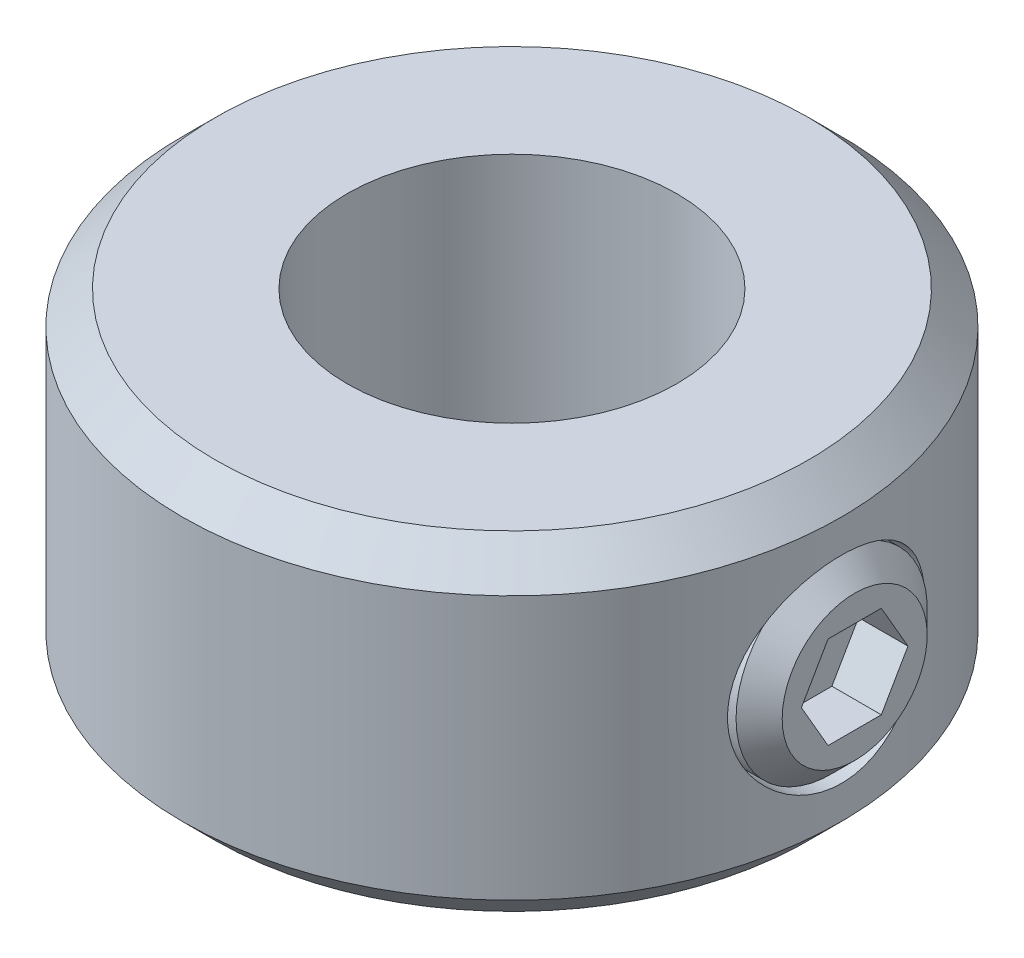
ISO-10303-21;
HEADER;
FILE_DESCRIPTION(('STEP AP214'),'2;1');
FILE_NAME('part.step','',(''),(''),'','','');
FILE_SCHEMA(('AUTOMOTIVE_DESIGN { 1 0 10303 214 1 1 1 1 }'));
ENDSEC;
DATA;
#1=APPLICATION_CONTEXT('core data for automotive mechanical design processes');
#2=APPLICATION_PROTOCOL_DEFINITION('international standard','automotive_design',2000,#1);
#3=PRODUCT_CONTEXT('',#1,'mechanical');
#4=PRODUCT('Part','Part','',(#3));
#5=PRODUCT_RELATED_PRODUCT_CATEGORY('part','',(#4));
#6=PRODUCT_DEFINITION_FORMATION('','',#4);
#7=PRODUCT_DEFINITION_CONTEXT('part definition',#1,'design');
#8=PRODUCT_DEFINITION('design','',#6,#7);
#9=PRODUCT_DEFINITION_SHAPE('','',#8);
#10=(LENGTH_UNIT() NAMED_UNIT(*) SI_UNIT(.MILLI.,.METRE.));
#11=(NAMED_UNIT(*) PLANE_ANGLE_UNIT() SI_UNIT($,.RADIAN.));
#12=(NAMED_UNIT(*) SI_UNIT($,.STERADIAN.) SOLID_ANGLE_UNIT());
#13=UNCERTAINTY_MEASURE_WITH_UNIT(LENGTH_MEASURE(1.E-05),#10,'distance_accuracy_value','');
#14=(GEOMETRIC_REPRESENTATION_CONTEXT(3) GLOBAL_UNCERTAINTY_ASSIGNED_CONTEXT((#13)) GLOBAL_UNIT_ASSIGNED_CONTEXT((#10,
#11,#12)) REPRESENTATION_CONTEXT('',''));
#15=CARTESIAN_POINT('',(0.,0.,0.));
#16=DIRECTION('',(0.,0.,1.));
#17=DIRECTION('',(1.,0.,0.));
#18=AXIS2_PLACEMENT_3D('',#15,#16,#17);
#19=CARTESIAN_POINT('',(5.2,2.5,0.));
#20=DIRECTION('',(-1.,0.,0.));
#21=DIRECTION('',(0.,0.,1.));
#22=AXIS2_PLACEMENT_3D('',#19,#20,#21);
#23=CYLINDRICAL_SURFACE('',#22,1.45);
#24=CARTESIAN_POINT('',(4.85,2.5,0.));
#25=DIRECTION('',(-1.,0.,0.));
#26=DIRECTION('',(0.,0.,1.));
#27=AXIS2_PLACEMENT_3D('',#24,#25,#26);
#28=CIRCLE('',#27,1.45);
#29=CARTESIAN_POINT('',(4.85,2.5,1.45));
#30=VERTEX_POINT('',#29);
#31=EDGE_CURVE('E70',#30,#30,#28,.T.);
#32=CARTESIAN_POINT('',(2.5,2.5,0.));
#33=DIRECTION('',(-1.,0.,0.));
#34=DIRECTION('',(0.,0.,1.));
#35=AXIS2_PLACEMENT_3D('',#32,#33,#34);
#36=CIRCLE('',#35,1.45);
#37=CARTESIAN_POINT('',(2.5,2.5,1.45));
#38=VERTEX_POINT('',#37);
#39=EDGE_CURVE('E164',#38,#38,#36,.T.);
#40=CARTESIAN_POINT('',(4.85,2.5,1.45));
#41=CARTESIAN_POINT('',(4.82552083333333,2.5,1.45));
#42=CARTESIAN_POINT('',(4.80104166666666,2.5,1.45));
#43=CARTESIAN_POINT('',(4.75208333333333,2.5,1.45));
#44=CARTESIAN_POINT('',(4.72760416666666,2.5,1.45));
#45=CARTESIAN_POINT('',(4.67864583333333,2.5,1.45));
#46=CARTESIAN_POINT('',(4.65416666666666,2.5,1.45));
#47=CARTESIAN_POINT('',(4.60520833333333,2.5,1.45));
#48=CARTESIAN_POINT('',(4.58072916666666,2.5,1.45));
#49=CARTESIAN_POINT('',(4.53177083333333,2.5,1.45));
#50=CARTESIAN_POINT('',(4.50729166666666,2.5,1.45));
#51=CARTESIAN_POINT('',(4.45833333333333,2.5,1.45));
#52=CARTESIAN_POINT('',(4.43385416666666,2.5,1.45));
#53=CARTESIAN_POINT('',(4.38489583333333,2.5,1.45));
#54=CARTESIAN_POINT('',(4.36041666666666,2.5,1.45));
#55=CARTESIAN_POINT('',(4.31145833333333,2.5,1.45));
#56=CARTESIAN_POINT('',(4.28697916666667,2.5,1.45));
#57=CARTESIAN_POINT('',(4.23802083333333,2.5,1.45));
#58=CARTESIAN_POINT('',(4.21354166666667,2.5,1.45));
#59=CARTESIAN_POINT('',(4.16458333333333,2.5,1.45));
#60=CARTESIAN_POINT('',(4.14010416666666,2.5,1.45));
#61=CARTESIAN_POINT('',(4.09114583333333,2.5,1.45));
#62=CARTESIAN_POINT('',(4.06666666666666,2.5,1.45));
#63=CARTESIAN_POINT('',(4.01770833333333,2.5,1.45));
#64=CARTESIAN_POINT('',(3.99322916666666,2.5,1.45));
#65=CARTESIAN_POINT('',(3.94427083333333,2.5,1.45));
#66=CARTESIAN_POINT('',(3.91979166666667,2.5,1.45));
#67=CARTESIAN_POINT('',(3.87083333333333,2.5,1.45));
#68=CARTESIAN_POINT('',(3.84635416666667,2.5,1.45));
#69=CARTESIAN_POINT('',(3.79739583333333,2.5,1.45));
#70=CARTESIAN_POINT('',(3.77291666666666,2.5,1.45));
#71=CARTESIAN_POINT('',(3.72395833333333,2.5,1.45));
#72=CARTESIAN_POINT('',(3.69947916666667,2.5,1.45));
#73=CARTESIAN_POINT('',(3.65052083333333,2.5,1.45));
#74=CARTESIAN_POINT('',(3.62604166666667,2.5,1.45));
#75=CARTESIAN_POINT('',(3.57708333333333,2.5,1.45));
#76=CARTESIAN_POINT('',(3.55260416666667,2.5,1.45));
#77=CARTESIAN_POINT('',(3.50364583333333,2.5,1.45));
#78=CARTESIAN_POINT('',(3.47916666666667,2.5,1.45));
#79=CARTESIAN_POINT('',(3.43020833333333,2.5,1.45));
#80=CARTESIAN_POINT('',(3.40572916666667,2.5,1.45));
#81=CARTESIAN_POINT('',(3.35677083333333,2.5,1.45));
#82=CARTESIAN_POINT('',(3.33229166666667,2.5,1.45));
#83=CARTESIAN_POINT('',(3.28333333333333,2.5,1.45));
#84=CARTESIAN_POINT('',(3.25885416666667,2.5,1.45));
#85=CARTESIAN_POINT('',(3.20989583333333,2.5,1.45));
#86=CARTESIAN_POINT('',(3.18541666666667,2.5,1.45));
#87=CARTESIAN_POINT('',(3.13645833333333,2.5,1.45));
#88=CARTESIAN_POINT('',(3.11197916666667,2.5,1.45));
#89=CARTESIAN_POINT('',(3.06302083333333,2.5,1.45));
#90=CARTESIAN_POINT('',(3.03854166666667,2.5,1.45));
#91=CARTESIAN_POINT('',(2.98958333333333,2.5,1.45));
#92=CARTESIAN_POINT('',(2.96510416666667,2.5,1.45));
#93=CARTESIAN_POINT('',(2.91614583333333,2.5,1.45));
#94=CARTESIAN_POINT('',(2.89166666666667,2.5,1.45));
#95=CARTESIAN_POINT('',(2.84270833333333,2.5,1.45));
#96=CARTESIAN_POINT('',(2.81822916666667,2.5,1.45));
#97=CARTESIAN_POINT('',(2.76927083333333,2.5,1.45));
#98=CARTESIAN_POINT('',(2.74479166666667,2.5,1.45));
#99=CARTESIAN_POINT('',(2.69583333333333,2.5,1.45));
#100=CARTESIAN_POINT('',(2.67135416666667,2.5,1.45));
#101=CARTESIAN_POINT('',(2.62239583333333,2.5,1.45));
#102=CARTESIAN_POINT('',(2.59791666666667,2.5,1.45));
#103=CARTESIAN_POINT('',(2.54895833333333,2.5,1.45));
#104=CARTESIAN_POINT('',(2.52447916666667,2.5,1.45));
#105=CARTESIAN_POINT('',(2.5,2.5,1.45));
#106=B_SPLINE_CURVE_WITH_KNOTS('',3,(#40,#41,#42,#43,#44,#45,#46,#47,#48,#49,#50,#51,#52,#53,
#54,#55,#56,#57,#58,#59,#60,#61,#62,#63,#64,#65,#66,#67,#68,#69,#70,#71,#72,#73,#74,#75,#76,#77,
#78,#79,#80,#81,#82,#83,#84,#85,#86,#87,#88,#89,#90,#91,#92,#93,#94,#95,#96,#97,#98,#99,#100,
#101,#102,#103,#104,#105),.UNSPECIFIED.,.F.,.F.,(4,2,2,2,2,2,2,2,2,2,2,2,2,2,2,2,2,2,2,2,2,2,2,
2,2,2,2,2,2,2,2,2,4),(0.,0.0734375000000006,0.146875,0.2203125,0.29375,0.3671875,0.440625,
0.5140625,0.587499999999999,0.660937499999999,0.734375,0.807812499999999,0.881249999999999,
0.954687499999999,1.028125,1.1015625,1.175,1.2484375,1.321875,1.3953125,1.46875,1.5421875,
1.615625,1.6890625,1.7625,1.8359375,1.909375,1.9828125,2.05625,2.1296875,2.203125,2.2765625,
2.35),.UNSPECIFIED.);
#107=EDGE_CURVE('BSEAM61',#30,#38,#106,.T.);
#108=ORIENTED_EDGE('',*,*,#31,.T.);
#109=ORIENTED_EDGE('',*,*,#39,.F.);
#110=ORIENTED_EDGE('',*,*,#107,.T.);
#111=ORIENTED_EDGE('',*,*,#107,.F.);
#112=EDGE_LOOP('',(#108,#110,#109,#111));
#113=FACE_BOUND('',#112,.T.);
#114=ADVANCED_FACE('F61',(#113),#23,.T.);
#115=CARTESIAN_POINT('',(5.2,2.5,0.));
#116=DIRECTION('',(-1.,0.,0.));
#117=DIRECTION('',(0.,0.,1.));
#118=AXIS2_PLACEMENT_3D('',#115,#116,#117);
#119=PLANE('',#118);
#120=DIRECTION('',(0.,0.866025403784439,0.5));
#121=VECTOR('',#120,1.);
#122=CARTESIAN_POINT('',(5.2,2.5,-0.808290376865476));
#123=LINE('',#122,#121);
#124=CARTESIAN_POINT('',(5.2,2.5,-0.808290376865476));
#125=VERTEX_POINT('',#124);
#126=CARTESIAN_POINT('',(5.2,3.2,-0.404145188432738));
#127=VERTEX_POINT('',#126);
#128=EDGE_CURVE('E151',#125,#127,#123,.T.);
#129=ORIENTED_EDGE('',*,*,#128,.F.);
#130=DIRECTION('',(0.,0.866025403784439,-0.5));
#131=VECTOR('',#130,1.);
#132=CARTESIAN_POINT('',(5.2,1.8,-0.404145188432738));
#133=LINE('',#132,#131);
#134=CARTESIAN_POINT('',(5.2,1.8,-0.404145188432738));
#135=VERTEX_POINT('',#134);
#136=EDGE_CURVE('E77',#135,#125,#133,.T.);
#137=ORIENTED_EDGE('',*,*,#136,.F.);
#138=DIRECTION('',(0.,0.,-1.));
#139=VECTOR('',#138,1.);
#140=CARTESIAN_POINT('',(5.2,1.8,0.404145188432738));
#141=LINE('',#140,#139);
#142=CARTESIAN_POINT('',(5.2,1.8,0.404145188432738));
#143=VERTEX_POINT('',#142);
#144=EDGE_CURVE('E160',#143,#135,#141,.T.);
#145=ORIENTED_EDGE('',*,*,#144,.F.);
#146=DIRECTION('',(0.,-0.866025403784439,-0.5));
#147=VECTOR('',#146,1.);
#148=CARTESIAN_POINT('',(5.2,2.5,0.808290376865476));
#149=LINE('',#148,#147);
#150=CARTESIAN_POINT('',(5.2,2.5,0.808290376865476));
#151=VERTEX_POINT('',#150);
#152=EDGE_CURVE('E158',#151,#143,#149,.T.);
#153=ORIENTED_EDGE('',*,*,#152,.F.);
#154=DIRECTION('',(0.,-0.866025403784439,0.5));
#155=VECTOR('',#154,1.);
#156=CARTESIAN_POINT('',(5.2,3.2,0.404145188432738));
#157=LINE('',#156,#155);
#158=CARTESIAN_POINT('',(5.2,3.2,0.404145188432738));
#159=VERTEX_POINT('',#158);
#160=EDGE_CURVE('E125',#159,#151,#157,.T.);
#161=ORIENTED_EDGE('',*,*,#160,.F.);
#162=DIRECTION('',(0.,0.,1.));
#163=VECTOR('',#162,1.);
#164=CARTESIAN_POINT('',(5.2,3.2,-0.404145188432738));
#165=LINE('',#164,#163);
#166=EDGE_CURVE('E154',#127,#159,#165,.T.);
#167=ORIENTED_EDGE('',*,*,#166,.F.);
#168=EDGE_LOOP('',(#129,#137,#145,#153,#161,#167));
#169=FACE_BOUND('',#168,.T.);
#170=CARTESIAN_POINT('',(5.2,2.5,0.));
#171=DIRECTION('',(-1.,0.,0.));
#172=DIRECTION('',(0.,0.,1.));
#173=AXIS2_PLACEMENT_3D('',#170,#171,#172);
#174=CIRCLE('',#173,1.1);
#175=CARTESIAN_POINT('',(5.2,2.5,1.1));
#176=VERTEX_POINT('',#175);
#177=EDGE_CURVE('E12',#176,#176,#174,.F.);
#178=ORIENTED_EDGE('',*,*,#177,.T.);
#179=EDGE_LOOP('',(#178));
#180=FACE_BOUND('',#179,.T.);
#181=ADVANCED_FACE('F186',(#169,#180),#119,.F.);
#182=CARTESIAN_POINT('',(2.5,2.5,0.));
#183=DIRECTION('',(-1.,0.,0.));
#184=DIRECTION('',(0.,0.,1.));
#185=AXIS2_PLACEMENT_3D('',#182,#183,#184);
#186=PLANE('',#185);
#187=ORIENTED_EDGE('',*,*,#39,.T.);
#188=EDGE_LOOP('',(#187));
#189=FACE_BOUND('',#188,.T.);
#190=ADVANCED_FACE('F178',(#189),#186,.T.);
#191=CARTESIAN_POINT('',(4.85,2.5,0.));
#192=DIRECTION('',(-1.,0.,0.));
#193=DIRECTION('',(0.,0.,1.));
#194=AXIS2_PLACEMENT_3D('',#191,#192,#193);
#195=CONICAL_SURFACE('',#194,1.45,0.785398163397449);
#196=ORIENTED_EDGE('',*,*,#177,.F.);
#197=EDGE_LOOP('',(#196));
#198=FACE_BOUND('',#197,.T.);
#199=ORIENTED_EDGE('',*,*,#31,.F.);
#200=EDGE_LOOP('',(#199));
#201=FACE_BOUND('',#200,.T.);
#202=ADVANCED_FACE('F64',(#198,#201),#195,.T.);
#203=CARTESIAN_POINT('',(4.45,1.8,-0.404145188432738));
#204=DIRECTION('',(0.,-0.5,-0.866025403784439));
#205=DIRECTION('',(0.,0.866025403784439,-0.5));
#206=AXIS2_PLACEMENT_3D('',#203,#204,#205);
#207=PLANE('',#206);
#208=ORIENTED_EDGE('',*,*,#136,.T.);
#209=DIRECTION('',(1.,0.,0.));
#210=VECTOR('',#209,1.);
#211=CARTESIAN_POINT('',(4.45,2.5,-0.808290376865476));
#212=LINE('',#211,#210);
#213=CARTESIAN_POINT('',(4.45,2.5,-0.808290376865476));
#214=VERTEX_POINT('',#213);
#215=EDGE_CURVE('E107',#214,#125,#212,.T.);
#216=ORIENTED_EDGE('',*,*,#215,.F.);
#217=DIRECTION('',(0.,0.866025403784439,-0.5));
#218=VECTOR('',#217,1.);
#219=CARTESIAN_POINT('',(4.45,1.8,-0.404145188432738));
#220=LINE('',#219,#218);
#221=CARTESIAN_POINT('',(4.45,1.8,-0.404145188432738));
#222=VERTEX_POINT('',#221);
#223=EDGE_CURVE('E162',#222,#214,#220,.T.);
#224=ORIENTED_EDGE('',*,*,#223,.F.);
#225=DIRECTION('',(1.,0.,0.));
#226=VECTOR('',#225,1.);
#227=CARTESIAN_POINT('',(4.45,1.8,-0.404145188432738));
#228=LINE('',#227,#226);
#229=EDGE_CURVE('E85',#222,#135,#228,.T.);
#230=ORIENTED_EDGE('',*,*,#229,.T.);
#231=EDGE_LOOP('',(#208,#216,#224,#230));
#232=FACE_BOUND('',#231,.T.);
#233=ADVANCED_FACE('F177',(#232),#207,.F.);
#234=CARTESIAN_POINT('',(4.45,1.8,0.404145188432738));
#235=DIRECTION('',(0.,-1.,0.));
#236=DIRECTION('',(0.,0.,-1.));
#237=AXIS2_PLACEMENT_3D('',#234,#235,#236);
#238=PLANE('',#237);
#239=ORIENTED_EDGE('',*,*,#144,.T.);
#240=ORIENTED_EDGE('',*,*,#229,.F.);
#241=DIRECTION('',(0.,0.,-1.));
#242=VECTOR('',#241,1.);
#243=CARTESIAN_POINT('',(4.45,1.8,0.404145188432738));
#244=LINE('',#243,#242);
#245=CARTESIAN_POINT('',(4.45,1.8,0.404145188432738));
#246=VERTEX_POINT('',#245);
#247=EDGE_CURVE('E137',#246,#222,#244,.T.);
#248=ORIENTED_EDGE('',*,*,#247,.F.);
#249=DIRECTION('',(1.,0.,0.));
#250=VECTOR('',#249,1.);
#251=CARTESIAN_POINT('',(4.45,1.8,0.404145188432738));
#252=LINE('',#251,#250);
#253=EDGE_CURVE('E129',#246,#143,#252,.T.);
#254=ORIENTED_EDGE('',*,*,#253,.T.);
#255=EDGE_LOOP('',(#239,#240,#248,#254));
#256=FACE_BOUND('',#255,.T.);
#257=ADVANCED_FACE('F184',(#256),#238,.F.);
#258=CARTESIAN_POINT('',(4.45,2.5,0.808290376865476));
#259=DIRECTION('',(0.,-0.5,0.866025403784439));
#260=DIRECTION('',(0.,-0.866025403784439,-0.5));
#261=AXIS2_PLACEMENT_3D('',#258,#259,#260);
#262=PLANE('',#261);
#263=ORIENTED_EDGE('',*,*,#152,.T.);
#264=ORIENTED_EDGE('',*,*,#253,.F.);
#265=DIRECTION('',(0.,-0.866025403784439,-0.5));
#266=VECTOR('',#265,1.);
#267=CARTESIAN_POINT('',(4.45,2.5,0.808290376865476));
#268=LINE('',#267,#266);
#269=CARTESIAN_POINT('',(4.45,2.5,0.808290376865476));
#270=VERTEX_POINT('',#269);
#271=EDGE_CURVE('E133',#270,#246,#268,.T.);
#272=ORIENTED_EDGE('',*,*,#271,.F.);
#273=DIRECTION('',(1.,0.,0.));
#274=VECTOR('',#273,1.);
#275=CARTESIAN_POINT('',(4.45,2.5,0.808290376865476));
#276=LINE('',#275,#274);
#277=EDGE_CURVE('E118',#270,#151,#276,.T.);
#278=ORIENTED_EDGE('',*,*,#277,.T.);
#279=EDGE_LOOP('',(#263,#264,#272,#278));
#280=FACE_BOUND('',#279,.T.);
#281=ADVANCED_FACE('F134',(#280),#262,.F.);
#282=CARTESIAN_POINT('',(4.45,3.2,0.404145188432738));
#283=DIRECTION('',(0.,0.5,0.866025403784438));
#284=DIRECTION('',(0.,-0.866025403784439,0.5));
#285=AXIS2_PLACEMENT_3D('',#282,#283,#284);
#286=PLANE('',#285);
#287=ORIENTED_EDGE('',*,*,#160,.T.);
#288=ORIENTED_EDGE('',*,*,#277,.F.);
#289=DIRECTION('',(0.,-0.866025403784439,0.5));
#290=VECTOR('',#289,1.);
#291=CARTESIAN_POINT('',(4.45,3.2,0.404145188432738));
#292=LINE('',#291,#290);
#293=CARTESIAN_POINT('',(4.45,3.2,0.404145188432738));
#294=VERTEX_POINT('',#293);
#295=EDGE_CURVE('E122',#294,#270,#292,.T.);
#296=ORIENTED_EDGE('',*,*,#295,.F.);
#297=DIRECTION('',(1.,0.,0.));
#298=VECTOR('',#297,1.);
#299=CARTESIAN_POINT('',(4.45,3.2,0.404145188432738));
#300=LINE('',#299,#298);
#301=EDGE_CURVE('E130',#294,#159,#300,.T.);
#302=ORIENTED_EDGE('',*,*,#301,.T.);
#303=EDGE_LOOP('',(#287,#288,#296,#302));
#304=FACE_BOUND('',#303,.T.);
#305=ADVANCED_FACE('F120',(#304),#286,.F.);
#306=CARTESIAN_POINT('',(4.45,3.2,-0.404145188432738));
#307=DIRECTION('',(0.,1.,0.));
#308=DIRECTION('',(0.,0.,1.));
#309=AXIS2_PLACEMENT_3D('',#306,#307,#308);
#310=PLANE('',#309);
#311=ORIENTED_EDGE('',*,*,#166,.T.);
#312=ORIENTED_EDGE('',*,*,#301,.F.);
#313=DIRECTION('',(0.,0.,1.));
#314=VECTOR('',#313,1.);
#315=CARTESIAN_POINT('',(4.45,3.2,-0.404145188432738));
#316=LINE('',#315,#314);
#317=CARTESIAN_POINT('',(4.45,3.2,-0.404145188432738));
#318=VERTEX_POINT('',#317);
#319=EDGE_CURVE('E143',#318,#294,#316,.T.);
#320=ORIENTED_EDGE('',*,*,#319,.F.);
#321=DIRECTION('',(1.,0.,0.));
#322=VECTOR('',#321,1.);
#323=CARTESIAN_POINT('',(4.45,3.2,-0.404145188432738));
#324=LINE('',#323,#322);
#325=EDGE_CURVE('E167',#318,#127,#324,.T.);
#326=ORIENTED_EDGE('',*,*,#325,.T.);
#327=EDGE_LOOP('',(#311,#312,#320,#326));
#328=FACE_BOUND('',#327,.T.);
#329=ADVANCED_FACE('F200',(#328),#310,.F.);
#330=CARTESIAN_POINT('',(4.45,2.5,-0.808290376865476));
#331=DIRECTION('',(0.,0.5,-0.866025403784439));
#332=DIRECTION('',(0.,0.866025403784439,0.5));
#333=AXIS2_PLACEMENT_3D('',#330,#331,#332);
#334=PLANE('',#333);
#335=ORIENTED_EDGE('',*,*,#128,.T.);
#336=ORIENTED_EDGE('',*,*,#325,.F.);
#337=DIRECTION('',(0.,0.866025403784439,0.5));
#338=VECTOR('',#337,1.);
#339=CARTESIAN_POINT('',(4.45,2.5,-0.808290376865476));
#340=LINE('',#339,#338);
#341=EDGE_CURVE('E145',#214,#318,#340,.T.);
#342=ORIENTED_EDGE('',*,*,#341,.F.);
#343=ORIENTED_EDGE('',*,*,#215,.T.);
#344=EDGE_LOOP('',(#335,#336,#342,#343));
#345=FACE_BOUND('',#344,.T.);
#346=ADVANCED_FACE('F197',(#345),#334,.F.);
#347=CARTESIAN_POINT('',(4.45,0.,0.));
#348=DIRECTION('',(1.,0.,0.));
#349=DIRECTION('',(0.,0.,-1.));
#350=AXIS2_PLACEMENT_3D('',#347,#348,#349);
#351=PLANE('',#350);
#352=ORIENTED_EDGE('',*,*,#223,.T.);
#353=ORIENTED_EDGE('',*,*,#341,.T.);
#354=ORIENTED_EDGE('',*,*,#319,.T.);
#355=ORIENTED_EDGE('',*,*,#295,.T.);
#356=ORIENTED_EDGE('',*,*,#271,.T.);
#357=ORIENTED_EDGE('',*,*,#247,.T.);
#358=EDGE_LOOP('',(#352,#353,#354,#355,#356,#357));
#359=FACE_BOUND('',#358,.T.);
#360=ADVANCED_FACE('F140',(#359),#351,.T.);
#361=CLOSED_SHELL('',(#114,#181,#190,#202,#233,#257,#281,#305,#329,#346,#360));
#362=MANIFOLD_SOLID_BREP('B2',#361);
#363=CARTESIAN_POINT('',(0.,5.,0.));
#364=DIRECTION('',(0.,1.,0.));
#365=DIRECTION('',(0.,0.,1.));
#366=AXIS2_PLACEMENT_3D('',#363,#364,#365);
#367=PLANE('',#366);
#368=CARTESIAN_POINT('',(0.,5.,0.));
#369=DIRECTION('',(0.,1.,0.));
#370=DIRECTION('',(0.,0.,1.));
#371=AXIS2_PLACEMENT_3D('',#368,#369,#370);
#372=CIRCLE('',#371,4.5);
#373=CARTESIAN_POINT('',(0.,5.,4.5));
#374=VERTEX_POINT('',#373);
#375=EDGE_CURVE('E60',#374,#374,#372,.T.);
#376=ORIENTED_EDGE('',*,*,#375,.T.);
#377=EDGE_LOOP('',(#376));
#378=FACE_BOUND('',#377,.T.);
#379=CARTESIAN_POINT('',(0.,5.,0.));
#380=DIRECTION('',(0.,1.,0.));
#381=DIRECTION('',(0.,0.,1.));
#382=AXIS2_PLACEMENT_3D('',#379,#380,#381);
#383=CIRCLE('',#382,2.5);
#384=CARTESIAN_POINT('',(0.,5.,2.5));
#385=VERTEX_POINT('',#384);
#386=EDGE_CURVE('E376',#385,#385,#383,.T.);
#387=ORIENTED_EDGE('',*,*,#386,.F.);
#388=EDGE_LOOP('',(#387));
#389=FACE_BOUND('',#388,.T.);
#390=ADVANCED_FACE('F351',(#378,#389),#367,.T.);
#391=CARTESIAN_POINT('',(0.,0.,0.));
#392=DIRECTION('',(0.,1.,0.));
#393=DIRECTION('',(0.,0.,1.));
#394=AXIS2_PLACEMENT_3D('',#391,#392,#393);
#395=PLANE('',#394);
#396=CARTESIAN_POINT('',(0.,0.,0.));
#397=DIRECTION('',(0.,1.,0.));
#398=DIRECTION('',(0.,0.,1.));
#399=AXIS2_PLACEMENT_3D('',#396,#397,#398);
#400=CIRCLE('',#399,4.5);
#401=CARTESIAN_POINT('',(0.,0.,4.5));
#402=VERTEX_POINT('',#401);
#403=EDGE_CURVE('E360',#402,#402,#400,.F.);
#404=ORIENTED_EDGE('',*,*,#403,.T.);
#405=EDGE_LOOP('',(#404));
#406=FACE_BOUND('',#405,.T.);
#407=CARTESIAN_POINT('',(0.,0.,0.));
#408=DIRECTION('',(0.,1.,0.));
#409=DIRECTION('',(0.,0.,1.));
#410=AXIS2_PLACEMENT_3D('',#407,#408,#409);
#411=CIRCLE('',#410,2.5);
#412=CARTESIAN_POINT('',(0.,0.,2.5));
#413=VERTEX_POINT('',#412);
#414=EDGE_CURVE('E377',#413,#413,#411,.T.);
#415=ORIENTED_EDGE('',*,*,#414,.T.);
#416=EDGE_LOOP('',(#415));
#417=FACE_BOUND('',#416,.T.);
#418=ADVANCED_FACE('F414',(#406,#417),#395,.F.);
#419=CARTESIAN_POINT('',(0.,5.,0.));
#420=DIRECTION('',(0.,-1.,0.));
#421=DIRECTION('',(0.,0.,-1.));
#422=AXIS2_PLACEMENT_3D('',#419,#420,#421);
#423=CYLINDRICAL_SURFACE('',#422,5.);
#424=CARTESIAN_POINT('',(0.,0.499999999999999,0.));
#425=DIRECTION('',(0.,1.,0.));
#426=DIRECTION('',(0.,0.,1.));
#427=AXIS2_PLACEMENT_3D('',#424,#425,#426);
#428=CIRCLE('',#427,5.);
#429=CARTESIAN_POINT('',(0.,0.499999999999999,5.));
#430=VERTEX_POINT('',#429);
#431=EDGE_CURVE('E365',#430,#430,#428,.T.);
#432=ORIENTED_EDGE('',*,*,#431,.T.);
#433=EDGE_LOOP('',(#432));
#434=FACE_BOUND('',#433,.T.);
#435=CARTESIAN_POINT('',(0.,4.5,0.));
#436=DIRECTION('',(0.,1.,0.));
#437=DIRECTION('',(0.,0.,1.));
#438=AXIS2_PLACEMENT_3D('',#435,#436,#437);
#439=CIRCLE('',#438,5.);
#440=CARTESIAN_POINT('',(0.,4.5,5.));
#441=VERTEX_POINT('',#440);
#442=EDGE_CURVE('E370',#441,#441,#439,.F.);
#443=ORIENTED_EDGE('',*,*,#442,.T.);
#444=EDGE_LOOP('',(#443));
#445=FACE_BOUND('',#444,.T.);
#446=CARTESIAN_POINT('',(4.76969600708473,2.5,-1.5));
#447=CARTESIAN_POINT('',(4.7696968572698,2.4178054520576,-1.49999897633764));
#448=CARTESIAN_POINT('',(4.77184390209069,2.33560077585597,-1.49322108167142));
#449=CARTESIAN_POINT('',(4.780165783029,2.17359475040806,-1.46635844446749));
#450=CARTESIAN_POINT('',(4.78634196493468,2.09379421349853,-1.44626925573578));
#451=CARTESIAN_POINT('',(4.80196102485633,1.93896527172827,-1.39352753269955));
#452=CARTESIAN_POINT('',(4.81139846703232,1.86392917036691,-1.36089589394243));
#453=CARTESIAN_POINT('',(4.83246932547567,1.7203780660047,-1.28406421917929));
#454=CARTESIAN_POINT('',(4.8441030704102,1.65186404131556,-1.23986245137053));
#455=CARTESIAN_POINT('',(4.86866862185766,1.52113360942262,-1.13964754141627));
#456=CARTESIAN_POINT('',(4.88162808311636,1.45915410205371,-1.08333207175807));
#457=CARTESIAN_POINT('',(4.90714861936757,1.34536204867749,-0.961136237579598));
#458=CARTESIAN_POINT('',(4.91970964297705,1.29355080955012,-0.895254645461111));
#459=CARTESIAN_POINT('',(4.94333214579389,1.20053730016669,-0.754111437793689));
#460=CARTESIAN_POINT('',(4.95435724342404,1.15957657555719,-0.678684021335814));
#461=CARTESIAN_POINT('',(4.97334435920684,1.09101274095724,-0.521624645369353));
#462=CARTESIAN_POINT('',(4.98130703789495,1.06340675014255,-0.439994028387911));
#463=CARTESIAN_POINT('',(4.99307646003589,1.02311999890949,-0.275323852630829));
#464=CARTESIAN_POINT('',(4.99699557369338,1.0100348723473,-0.1923913989538));
#465=CARTESIAN_POINT('',(5.00063201501348,0.99788267535356,-0.0254218237493143));
#466=CARTESIAN_POINT('',(5.00035022521079,0.998812660598037,0.058615062050369));
#467=CARTESIAN_POINT('',(4.99569603817659,1.01439286854302,0.222571156600161));
#468=CARTESIAN_POINT('',(4.9914542020526,1.02860519380987,0.302536267641342));
#469=CARTESIAN_POINT('',(4.97951522112593,1.06963133599429,0.458889213442527));
#470=CARTESIAN_POINT('',(4.97181785750586,1.09644595094267,0.535276821322847));
#471=CARTESIAN_POINT('',(4.95365220986963,1.16221202341856,0.683347326351281));
#472=CARTESIAN_POINT('',(4.94315269676706,1.20130120280727,0.754965064694478));
#473=CARTESIAN_POINT('',(4.92049640648069,1.29039785242823,0.890764673783156));
#474=CARTESIAN_POINT('',(4.90833923637778,1.34040791296348,0.954944774872131));
#475=CARTESIAN_POINT('',(4.88311550488165,1.4521977507516,1.0766604815298));
#476=CARTESIAN_POINT('',(4.87003195321461,1.51435691902974,1.13384458040112));
#477=CARTESIAN_POINT('',(4.84483979887497,1.64751001789005,1.23707651539824));
#478=CARTESIAN_POINT('',(4.8327312931702,1.71850482538923,1.28312324482853));
#479=CARTESIAN_POINT('',(4.81077903197678,1.86823946924899,1.3631399533545));
#480=CARTESIAN_POINT('',(4.80095810695957,1.94704704586292,1.39698989237679));
#481=CARTESIAN_POINT('',(4.78496392548436,2.10960720844554,1.45083362878413));
#482=CARTESIAN_POINT('',(4.7787894791583,2.19335817153456,1.4708319464056));
#483=CARTESIAN_POINT('',(4.77104849541241,2.36008236073928,1.49574770282165));
#484=CARTESIAN_POINT('',(4.7693187867044,2.44296822389398,1.50119946380212));
#485=CARTESIAN_POINT('',(4.77021192441924,2.60847290000987,1.49835947233062));
#486=CARTESIAN_POINT('',(4.77283416156589,2.69109174873085,1.4900696437133));
#487=CARTESIAN_POINT('',(4.78197558554912,2.85148837797087,1.4604576357419));
#488=CARTESIAN_POINT('',(4.78839176507489,2.92933616426352,1.4394796143128));
#489=CARTESIAN_POINT('',(4.80429141231227,3.08040169081492,1.3854857774794));
#490=CARTESIAN_POINT('',(4.81377535359073,3.15361871414057,1.35246810342759));
#491=CARTESIAN_POINT('',(4.83505835023047,3.29551746407213,1.274318711965));
#492=CARTESIAN_POINT('',(4.84691271069799,3.36402472098579,1.22888564172729));
#493=CARTESIAN_POINT('',(4.87148205646987,3.4926381061808,1.12755301600385));
#494=CARTESIAN_POINT('',(4.88419724730003,3.55274221761279,1.07165095534896));
#495=CARTESIAN_POINT('',(4.90963633548158,3.66518040581474,0.948455132493598));
#496=CARTESIAN_POINT('',(4.92234245063004,3.71713562898698,0.880811065857433));
#497=CARTESIAN_POINT('',(4.94584851748651,3.80896670102775,0.737461784590248));
#498=CARTESIAN_POINT('',(4.95664856384717,3.84884314978146,0.661756970543943));
#499=CARTESIAN_POINT('',(4.97505970474957,3.9150000305683,0.50493550470522));
#500=CARTESIAN_POINT('',(4.98269453424966,3.94138201615898,0.423864622037837));
#501=CARTESIAN_POINT('',(4.99401979596827,3.98006091889042,0.258169966504587));
#502=CARTESIAN_POINT('',(4.9977113567088,3.99236186594842,0.173547217354761));
#503=CARTESIAN_POINT('',(5.00066544081399,4.0022230440545,0.00665215388274119));
#504=CARTESIAN_POINT('',(5.00009305111322,4.00033269540783,-0.0755851790862083));
#505=CARTESIAN_POINT('',(4.99497264465037,3.98317836750088,-0.238519481164405));
#506=CARTESIAN_POINT('',(4.99042485330463,3.96791514651956,-0.31921653734653));
#507=CARTESIAN_POINT('',(4.97791168358327,3.92478833860037,-0.475935813041359));
#508=CARTESIAN_POINT('',(4.96998352900866,3.89706181935099,-0.551998927351393));
#509=CARTESIAN_POINT('',(4.9515294303945,3.82991808549281,-0.698433237752054));
#510=CARTESIAN_POINT('',(4.94100305949946,3.79049894971381,-0.768803496050581));
#511=CARTESIAN_POINT('',(4.91803965828228,3.69962654256996,-0.904301892420564));
#512=CARTESIAN_POINT('',(4.90555226923559,3.64782856999923,-0.969190250076767));
#513=CARTESIAN_POINT('',(4.88023537212334,3.5342896116672,-1.08953757134595));
#514=CARTESIAN_POINT('',(4.86740576641079,3.47254576210185,-1.14499380960194));
#515=CARTESIAN_POINT('',(4.84240680631319,3.33865922168949,-1.24656269394549));
#516=CARTESIAN_POINT('',(4.83026852693485,3.26626144660956,-1.29234759757956));
#517=CARTESIAN_POINT('',(4.80852547508793,3.11444482583898,-1.37104313528776));
#518=CARTESIAN_POINT('',(4.79891948596955,3.0350293763988,-1.40395995557289));
#519=CARTESIAN_POINT('',(4.78427816717595,2.88025956839373,-1.4530194253295));
#520=CARTESIAN_POINT('',(4.7788615484052,2.80539135306901,-1.47058859011232));
#521=CARTESIAN_POINT('',(4.77157042597167,2.65368477750423,-1.49407818835144));
#522=CARTESIAN_POINT('',(4.7696952122143,2.57684681535475,-1.50000095706095));
#523=CARTESIAN_POINT('',(4.76969600708473,2.5,-1.5));
#524=B_SPLINE_CURVE_WITH_KNOTS('',3,(#446,#447,#448,#449,#450,#451,#452,#453,#454,#455,#456,
#457,#458,#459,#460,#461,#462,#463,#464,#465,#466,#467,#468,#469,#470,#471,#472,#473,#474,#475,
#476,#477,#478,#479,#480,#481,#482,#483,#484,#485,#486,#487,#488,#489,#490,#491,#492,#493,#494,
#495,#496,#497,#498,#499,#500,#501,#502,#503,#504,#505,#506,#507,#508,#509,#510,#511,#512,#513,
#514,#515,#516,#517,#518,#519,#520,#521,#522,#523),.UNSPECIFIED.,.T.,.F.,(4,2,2,2,2,2,2,2,2,2,2,
2,2,2,2,2,2,2,2,2,2,2,2,2,2,2,2,2,2,2,2,2,2,2,2,2,2,2,4),(0.,0.246300165915543,0.492682641689,
0.738656414466194,0.984667025370102,1.23773150007984,1.49082847871273,1.74915939273645,
2.00743455587877,2.25832140149558,2.5091555410144,2.7520012599088,2.99486235890376,
3.24055209335676,3.4863001659083,3.74152147023278,3.99676812491863,4.25446238246266,
4.51207250628411,4.76008080790309,5.00805439107388,5.24958594938817,5.49115481045787,
5.73920731809388,5.98731925928923,6.24479506100602,6.50225807324202,6.75775391814325,
7.01317662321682,7.2587630391122,7.50433553047754,7.74727096872219,7.99024634491378,
8.24099627054488,8.4918185262989,8.75011639669147,9.00828993963944,9.23861153857447,
9.4688869503356),.UNSPECIFIED.);
#525=CARTESIAN_POINT('',(4.76969600708473,2.5,-1.5));
#526=VERTEX_POINT('',#525);
#527=EDGE_CURVE('E381',#526,#526,#524,.T.);
#528=ORIENTED_EDGE('',*,*,#527,.T.);
#529=EDGE_LOOP('',(#528));
#530=FACE_BOUND('',#529,.T.);
#531=ADVANCED_FACE('F398',(#434,#445,#530),#423,.T.);
#532=CARTESIAN_POINT('',(0.,5.,0.));
#533=DIRECTION('',(0.,-1.,0.));
#534=DIRECTION('',(0.,0.,-1.));
#535=AXIS2_PLACEMENT_3D('',#532,#533,#534);
#536=CYLINDRICAL_SURFACE('',#535,2.5);
#537=CARTESIAN_POINT('',(2.,2.5,-1.5));
#538=CARTESIAN_POINT('',(1.99999416642511,2.57547897528964,-1.50000404108592));
#539=CARTESIAN_POINT('',(2.00433633903481,2.6509384340798,-1.49426852824013));
#540=CARTESIAN_POINT('',(2.02092590613883,2.79932390396222,-1.47174965152787));
#541=CARTESIAN_POINT('',(2.03318155043097,2.8722471873851,-1.45495475788936));
#542=CARTESIAN_POINT('',(2.0636233903473,3.01308364167728,-1.41143486335795));
#543=CARTESIAN_POINT('',(2.0817666618312,3.08102883803527,-1.3847815450315));
#544=CARTESIAN_POINT('',(2.12185904995836,3.21143745336792,-1.32252909283019));
#545=CARTESIAN_POINT('',(2.14380930122416,3.27389922969514,-1.28692729054693));
#546=CARTESIAN_POINT('',(2.19228594587542,3.39994901666408,-1.20271292747644));
#547=CARTESIAN_POINT('',(2.21904371037662,3.46274095712394,-1.15304179435289));
#548=CARTESIAN_POINT('',(2.27226229431061,3.57976476274175,-1.04426801309985));
#549=CARTESIAN_POINT('',(2.29872287517103,3.6339901516708,-0.985158296729613));
#550=CARTESIAN_POINT('',(2.35175567858734,3.7381338097097,-0.851442367411701));
#551=CARTESIAN_POINT('',(2.37803133577818,3.78695446366975,-0.775851995162548));
#552=CARTESIAN_POINT('',(2.42443786983179,3.87080972244443,-0.615654228271658));
#553=CARTESIAN_POINT('',(2.44457437988735,3.90585697412271,-0.53105519662633));
#554=CARTESIAN_POINT('',(2.4747098780044,3.95759592281265,-0.363771406742666));
#555=CARTESIAN_POINT('',(2.4854930393917,3.9757203609673,-0.281674698130915));
#556=CARTESIAN_POINT('',(2.49874939277545,3.99794280286312,-0.114970509382708));
#557=CARTESIAN_POINT('',(2.50123038813307,4.00205397800005,-0.0303654624001529));
#558=CARTESIAN_POINT('',(2.49783372711539,3.99638625265754,0.12763728373731));
#559=CARTESIAN_POINT('',(2.49295437513726,3.98826647383069,0.201123832865635));
#560=CARTESIAN_POINT('',(2.47707997553857,3.96152020435189,0.345464269151768));
#561=CARTESIAN_POINT('',(2.46608447529309,3.94289293609285,0.416317961051202));
#562=CARTESIAN_POINT('',(2.43884907201719,3.89583443729622,0.55405678046908));
#563=CARTESIAN_POINT('',(2.42257910450824,3.867346938861,0.620916491037617));
#564=CARTESIAN_POINT('',(2.38609637638748,3.80161538377446,0.748988660115611));
#565=CARTESIAN_POINT('',(2.36588259201812,3.76436905294099,0.810199646208011));
#566=CARTESIAN_POINT('',(2.32037925976363,3.67716090719555,0.933074267143199));
#567=CARTESIAN_POINT('',(2.2947718295215,3.62621168826426,0.993918663198193));
#568=CARTESIAN_POINT('',(2.24255554245601,3.51559588213982,1.10671465909275));
#569=CARTESIAN_POINT('',(2.21594536703375,3.45591749652549,1.1586540130834));
#570=CARTESIAN_POINT('',(2.16111075123946,3.32134659383645,1.25824837767417));
#571=CARTESIAN_POINT('',(2.13305661385124,3.24549242346054,1.30470933188632));
#572=CARTESIAN_POINT('',(2.08250879557267,3.08529376836339,1.38397217194232));
#573=CARTESIAN_POINT('',(2.0600049029882,3.00096528387436,1.41679921962189));
#574=CARTESIAN_POINT('',(2.02895865196731,2.84760636810465,1.46077497064842));
#575=CARTESIAN_POINT('',(2.01833888618316,2.77995936770336,1.47527903312665));
#576=CARTESIAN_POINT('',(2.00392150777558,2.64262638970052,1.49480872755284));
#577=CARTESIAN_POINT('',(2.00011596115116,2.57294287951544,1.49984538302907));
#578=CARTESIAN_POINT('',(1.99988914321323,2.43344831756429,1.50014781114183));
#579=CARTESIAN_POINT('',(2.00347810223984,2.36363722278479,1.49540004697659));
#580=CARTESIAN_POINT('',(2.01751520788652,2.22601265625144,1.47640290574941));
#581=CARTESIAN_POINT('',(2.02796877613213,2.15820080775975,1.46214601830139));
#582=CARTESIAN_POINT('',(2.054317683331,2.02628542052021,1.42488312618657));
#583=CARTESIAN_POINT('',(2.07020622092812,1.96217736346777,1.40188805257362));
#584=CARTESIAN_POINT('',(2.10571539417587,1.83852228426982,1.34796261057072));
#585=CARTESIAN_POINT('',(2.12533743689999,1.778976993634,1.31702924888212));
#586=CARTESIAN_POINT('',(2.17036819177737,1.65475991748775,1.24167439558512));
#587=CARTESIAN_POINT('',(2.19618239397369,1.59109916490343,1.19582663060303));
#588=CARTESIAN_POINT('',(2.2482175480362,1.47171451515054,1.09487395518701));
#589=CARTESIAN_POINT('',(2.27443886711455,1.41599830783088,1.03976018672402));
#590=CARTESIAN_POINT('',(2.32835625910913,1.30677599264957,0.913274837212767));
#591=CARTESIAN_POINT('',(2.3558007587587,1.25449927339416,0.840721108780192));
#592=CARTESIAN_POINT('',(2.40537639133459,1.16309722316335,0.68610310086802));
#593=CARTESIAN_POINT('',(2.42751104449411,1.12396317215908,0.604045176134703));
#594=CARTESIAN_POINT('',(2.46252280092775,1.06313179656863,0.438840232972139));
#595=CARTESIAN_POINT('',(2.47595588067329,1.04037377220889,0.356205963651259));
#596=CARTESIAN_POINT('',(2.494407389061,1.00928539715374,0.187383063890858));
#597=CARTESIAN_POINT('',(2.49943534582737,1.00093870928238,0.10119857178197));
#598=CARTESIAN_POINT('',(2.50040600461976,0.999325391414073,-0.0598120232009833));
#599=CARTESIAN_POINT('',(2.49747057186327,1.00419666543697,-0.134620583589705));
#600=CARTESIAN_POINT('',(2.48512948412095,1.02489382438161,-0.282148755978773));
#601=CARTESIAN_POINT('',(2.47572375706639,1.0407198313216,-0.354868344701913));
#602=CARTESIAN_POINT('',(2.45149427526962,1.08221957158378,-0.495145481978796));
#603=CARTESIAN_POINT('',(2.43675966858906,1.10773159612924,-0.562767032608829));
#604=CARTESIAN_POINT('',(2.40303337447155,1.16764059455475,-0.692781971999983));
#605=CARTESIAN_POINT('',(2.38404073252268,1.2020395608596,-0.755174184199831));
#606=CARTESIAN_POINT('',(2.34093432659381,1.28292519656876,-0.880263645295947));
#607=CARTESIAN_POINT('',(2.31648844639149,1.33031870901687,-0.942258690439939));
#608=CARTESIAN_POINT('',(2.26601907350661,1.43375303371772,-1.05789751536307));
#609=CARTESIAN_POINT('',(2.23999385274509,1.48980342560791,-1.11153190956916));
#610=CARTESIAN_POINT('',(2.18528165666204,1.6172855621777,-1.2159097535057));
#611=CARTESIAN_POINT('',(2.15667566270901,1.6897664861655,-1.26542406663367));
#612=CARTESIAN_POINT('',(2.10376464485145,1.84348485276654,-1.35156817210325));
#613=CARTESIAN_POINT('',(2.07945738811052,1.92471771398141,-1.38820466322661));
#614=CARTESIAN_POINT('',(2.0408000304796,2.0870642851372,-1.44437116535132));
#615=CARTESIAN_POINT('',(2.02577665830138,2.16759523596125,-1.46509526060187));
#616=CARTESIAN_POINT('',(2.00539032320036,2.33209739470368,-1.49289268240426));
#617=CARTESIAN_POINT('',(2.00000648744643,2.41606076575871,-1.49999550595837));
#618=CARTESIAN_POINT('',(2.,2.5,-1.5));
#619=B_SPLINE_CURVE_WITH_KNOTS('',3,(#537,#538,#539,#540,#541,#542,#543,#544,#545,#546,#547,
#548,#549,#550,#551,#552,#553,#554,#555,#556,#557,#558,#559,#560,#561,#562,#563,#564,#565,#566,
#567,#568,#569,#570,#571,#572,#573,#574,#575,#576,#577,#578,#579,#580,#581,#582,#583,#584,#585,
#586,#587,#588,#589,#590,#591,#592,#593,#594,#595,#596,#597,#598,#599,#600,#601,#602,#603,#604,
#605,#606,#607,#608,#609,#610,#611,#612,#613,#614,#615,#616,#617,#618),.UNSPECIFIED.,.T.,.F.,(4,
2,2,2,2,2,2,2,2,2,2,2,2,2,2,2,2,2,2,2,2,2,2,2,2,2,2,2,2,2,2,2,2,2,2,2,2,2,2,2,4),(0.,
0.226085249493392,0.45240657433077,0.677113624991876,0.901887762215932,1.15414462390001,
1.40659128601844,1.68630157736223,1.9657544327122,2.21853330858497,2.47107452602766,
2.69230130543182,2.91354445887944,3.13607155036377,3.35865648368878,3.60782810055849,
3.85733966656908,4.13576671140276,4.41367760154768,4.62276298054684,4.83160475643976,
5.04073566011181,5.25003193304128,5.45906724365495,5.6681814915466,5.91499438482002,
6.16204457978454,6.44121828011588,6.72020638384847,6.97891479383337,7.23732973022726,
7.46129321849399,7.68525920139648,7.90563970188756,8.12606965394584,8.37042963549487,
8.61506198741954,8.89071695766603,9.16622832484805,9.41820120134354,9.66962780912277),.UNSPECIFIED.);
#620=CARTESIAN_POINT('',(2.,2.5,-1.5));
#621=VERTEX_POINT('',#620);
#622=EDGE_CURVE('E393',#621,#621,#619,.T.);
#623=ORIENTED_EDGE('',*,*,#622,.T.);
#624=EDGE_LOOP('',(#623));
#625=FACE_BOUND('',#624,.T.);
#626=ORIENTED_EDGE('',*,*,#386,.T.);
#627=EDGE_LOOP('',(#626));
#628=FACE_BOUND('',#627,.T.);
#629=ORIENTED_EDGE('',*,*,#414,.F.);
#630=EDGE_LOOP('',(#629));
#631=FACE_BOUND('',#630,.T.);
#632=ADVANCED_FACE('F406',(#625,#628,#631),#536,.F.);
#633=CARTESIAN_POINT('',(-5.001,2.5,0.));
#634=DIRECTION('',(1.,0.,0.));
#635=DIRECTION('',(0.,0.,-1.));
#636=AXIS2_PLACEMENT_3D('',#633,#634,#635);
#637=CYLINDRICAL_SURFACE('',#636,1.5);
#638=ORIENTED_EDGE('',*,*,#622,.F.);
#639=EDGE_LOOP('',(#638));
#640=FACE_BOUND('',#639,.T.);
#641=ORIENTED_EDGE('',*,*,#527,.F.);
#642=EDGE_LOOP('',(#641));
#643=FACE_BOUND('',#642,.T.);
#644=ADVANCED_FACE('F401',(#640,#643),#637,.F.);
#645=CARTESIAN_POINT('',(0.,0.499999999999999,0.));
#646=DIRECTION('',(0.,1.,0.));
#647=DIRECTION('',(0.,0.,1.));
#648=AXIS2_PLACEMENT_3D('',#645,#646,#647);
#649=CONICAL_SURFACE('',#648,5.,0.78539816339745);
#650=ORIENTED_EDGE('',*,*,#403,.F.);
#651=EDGE_LOOP('',(#650));
#652=FACE_BOUND('',#651,.T.);
#653=ORIENTED_EDGE('',*,*,#431,.F.);
#654=EDGE_LOOP('',(#653));
#655=FACE_BOUND('',#654,.T.);
#656=ADVANCED_FACE('F405',(#652,#655),#649,.T.);
#657=CARTESIAN_POINT('',(0.,5.,0.));
#658=DIRECTION('',(0.,-1.,0.));
#659=DIRECTION('',(0.,0.,-1.));
#660=AXIS2_PLACEMENT_3D('',#657,#658,#659);
#661=CONICAL_SURFACE('',#660,4.5,0.785398163397447);
#662=ORIENTED_EDGE('',*,*,#442,.F.);
#663=EDGE_LOOP('',(#662));
#664=FACE_BOUND('',#663,.T.);
#665=ORIENTED_EDGE('',*,*,#375,.F.);
#666=EDGE_LOOP('',(#665));
#667=FACE_BOUND('',#666,.T.);
#668=ADVANCED_FACE('F354',(#664,#667),#661,.T.);
#669=CLOSED_SHELL('',(#390,#418,#531,#632,#644,#656,#668));
#670=MANIFOLD_SOLID_BREP('B6',#669);
#671=ADVANCED_BREP_SHAPE_REPRESENTATION('',(#18,#362,#670),#14);
#672=SHAPE_DEFINITION_REPRESENTATION(#9,#671);
ENDSEC;
END-ISO-10303-21;
